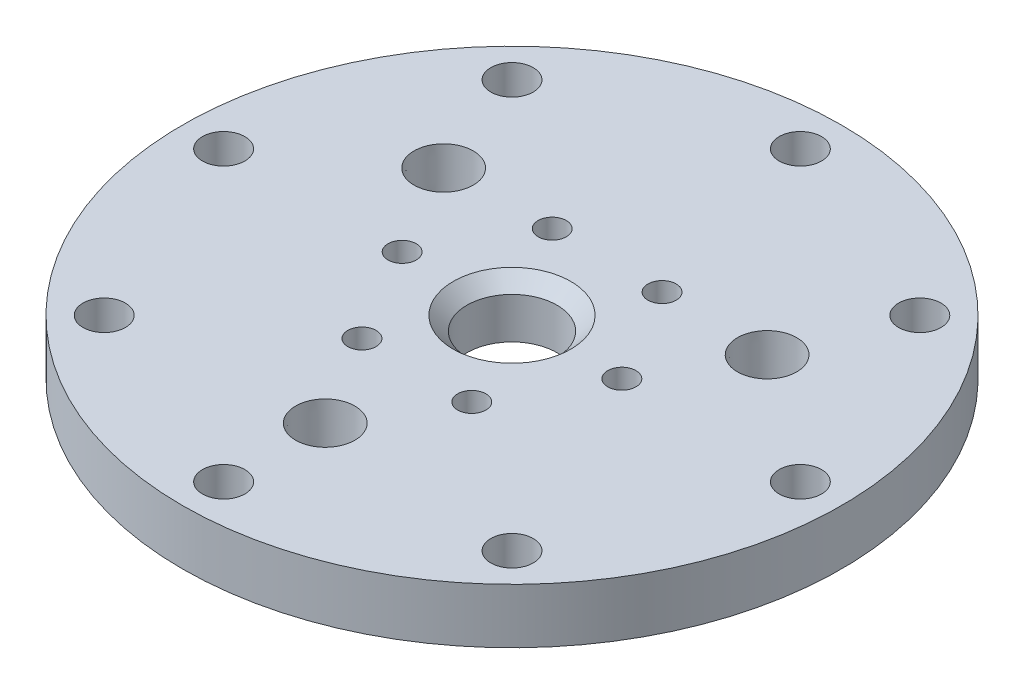
ISO-10303-21;
HEADER;
FILE_DESCRIPTION(('STEP AP214'),'2;1');
FILE_NAME('part.step','',(''),(''),'','','');
FILE_SCHEMA(('AUTOMOTIVE_DESIGN { 1 0 10303 214 1 1 1 1 }'));
ENDSEC;
DATA;
#1=APPLICATION_CONTEXT('core data for automotive mechanical design processes');
#2=APPLICATION_PROTOCOL_DEFINITION('international standard','automotive_design',2000,#1);
#3=PRODUCT_CONTEXT('',#1,'mechanical');
#4=PRODUCT('Part','Part','',(#3));
#5=PRODUCT_RELATED_PRODUCT_CATEGORY('part','',(#4));
#6=PRODUCT_DEFINITION_FORMATION('','',#4);
#7=PRODUCT_DEFINITION_CONTEXT('part definition',#1,'design');
#8=PRODUCT_DEFINITION('design','',#6,#7);
#9=PRODUCT_DEFINITION_SHAPE('','',#8);
#10=(LENGTH_UNIT() NAMED_UNIT(*) SI_UNIT(.MILLI.,.METRE.));
#11=(NAMED_UNIT(*) PLANE_ANGLE_UNIT() SI_UNIT($,.RADIAN.));
#12=(NAMED_UNIT(*) SI_UNIT($,.STERADIAN.) SOLID_ANGLE_UNIT());
#13=UNCERTAINTY_MEASURE_WITH_UNIT(LENGTH_MEASURE(1.E-05),#10,'distance_accuracy_value','');
#14=(GEOMETRIC_REPRESENTATION_CONTEXT(3) GLOBAL_UNCERTAINTY_ASSIGNED_CONTEXT((#13)) GLOBAL_UNIT_ASSIGNED_CONTEXT((#10,
#11,#12)) REPRESENTATION_CONTEXT('',''));
#15=CARTESIAN_POINT('',(0.,0.,0.));
#16=DIRECTION('',(0.,0.,1.));
#17=DIRECTION('',(1.,0.,0.));
#18=AXIS2_PLACEMENT_3D('',#15,#16,#17);
#19=CARTESIAN_POINT('',(0.,12.7,0.));
#20=DIRECTION('',(0.,-1.,0.));
#21=DIRECTION('',(0.,0.,-1.));
#22=AXIS2_PLACEMENT_3D('',#19,#20,#21);
#23=CYLINDRICAL_SURFACE('',#22,76.2);
#24=CARTESIAN_POINT('',(0.,12.7,0.));
#25=DIRECTION('',(0.,1.,0.));
#26=DIRECTION('',(0.,0.,1.));
#27=AXIS2_PLACEMENT_3D('',#24,#25,#26);
#28=CIRCLE('',#27,76.2);
#29=CARTESIAN_POINT('',(0.,12.7,76.2));
#30=VERTEX_POINT('',#29);
#31=EDGE_CURVE('E42',#30,#30,#28,.T.);
#32=ORIENTED_EDGE('',*,*,#31,.F.);
#33=EDGE_LOOP('',(#32));
#34=FACE_BOUND('',#33,.T.);
#35=CARTESIAN_POINT('',(0.,0.,0.));
#36=DIRECTION('',(0.,1.,0.));
#37=DIRECTION('',(0.,0.,1.));
#38=AXIS2_PLACEMENT_3D('',#35,#36,#37);
#39=CIRCLE('',#38,76.2);
#40=CARTESIAN_POINT('',(0.,0.,76.2));
#41=VERTEX_POINT('',#40);
#42=EDGE_CURVE('E46',#41,#41,#39,.T.);
#43=ORIENTED_EDGE('',*,*,#42,.T.);
#44=EDGE_LOOP('',(#43));
#45=FACE_BOUND('',#44,.T.);
#46=ADVANCED_FACE('F31',(#34,#45),#23,.T.);
#47=CARTESIAN_POINT('',(0.,12.7,0.));
#48=DIRECTION('',(0.,1.,0.));
#49=DIRECTION('',(0.,0.,1.));
#50=AXIS2_PLACEMENT_3D('',#47,#48,#49);
#51=PLANE('',#50);
#52=CARTESIAN_POINT('',(0.,12.7,0.));
#53=DIRECTION('',(0.,1.,0.));
#54=DIRECTION('',(0.,0.,1.));
#55=AXIS2_PLACEMENT_3D('',#52,#53,#54);
#56=CIRCLE('',#55,13.589);
#57=CARTESIAN_POINT('',(0.,12.7,13.589));
#58=VERTEX_POINT('',#57);
#59=EDGE_CURVE('E10',#58,#58,#56,.F.);
#60=ORIENTED_EDGE('',*,*,#59,.T.);
#61=EDGE_LOOP('',(#60));
#62=FACE_BOUND('',#61,.T.);
#63=CARTESIAN_POINT('',(0.,12.7,43.18));
#64=DIRECTION('',(0.,1.,0.));
#65=DIRECTION('',(0.,0.,1.));
#66=AXIS2_PLACEMENT_3D('',#63,#64,#65);
#67=CIRCLE('',#66,6.8545837);
#68=CARTESIAN_POINT('',(0.,12.7,50.0345837));
#69=VERTEX_POINT('',#68);
#70=EDGE_CURVE('E168',#69,#69,#67,.T.);
#71=ORIENTED_EDGE('',*,*,#70,.F.);
#72=EDGE_LOOP('',(#71));
#73=FACE_BOUND('',#72,.T.);
#74=CARTESIAN_POINT('',(37.3949769354121,12.7,-21.59));
#75=DIRECTION('',(0.,1.,0.));
#76=DIRECTION('',(0.,0.,1.));
#77=AXIS2_PLACEMENT_3D('',#74,#75,#76);
#78=CIRCLE('',#77,6.8545837);
#79=CARTESIAN_POINT('',(37.3949769354121,12.7,-14.7354163));
#80=VERTEX_POINT('',#79);
#81=EDGE_CURVE('E156',#80,#80,#78,.T.);
#82=ORIENTED_EDGE('',*,*,#81,.F.);
#83=EDGE_LOOP('',(#82));
#84=FACE_BOUND('',#83,.T.);
#85=CARTESIAN_POINT('',(-37.3949769354121,12.7,-21.59));
#86=DIRECTION('',(0.,1.,0.));
#87=DIRECTION('',(0.,0.,1.));
#88=AXIS2_PLACEMENT_3D('',#85,#86,#87);
#89=CIRCLE('',#88,6.8545837);
#90=CARTESIAN_POINT('',(-37.3949769354121,12.7,-14.7354163));
#91=VERTEX_POINT('',#90);
#92=EDGE_CURVE('E144',#91,#91,#89,.T.);
#93=ORIENTED_EDGE('',*,*,#92,.F.);
#94=EDGE_LOOP('',(#93));
#95=FACE_BOUND('',#94,.T.);
#96=CARTESIAN_POINT('',(25.4,12.7,0.));
#97=DIRECTION('',(0.,1.,0.));
#98=DIRECTION('',(0.,0.,1.));
#99=AXIS2_PLACEMENT_3D('',#96,#97,#98);
#100=CIRCLE('',#99,3.2639);
#101=CARTESIAN_POINT('',(25.4,12.7,3.2639));
#102=VERTEX_POINT('',#101);
#103=EDGE_CURVE('E132',#102,#102,#100,.T.);
#104=ORIENTED_EDGE('',*,*,#103,.F.);
#105=EDGE_LOOP('',(#104));
#106=FACE_BOUND('',#105,.T.);
#107=CARTESIAN_POINT('',(12.7,12.7,-21.9970452561248));
#108=DIRECTION('',(0.,1.,0.));
#109=DIRECTION('',(0.,0.,1.));
#110=AXIS2_PLACEMENT_3D('',#107,#108,#109);
#111=CIRCLE('',#110,3.2639);
#112=CARTESIAN_POINT('',(12.7,12.7,-18.7331452561248));
#113=VERTEX_POINT('',#112);
#114=EDGE_CURVE('E126',#113,#113,#111,.T.);
#115=ORIENTED_EDGE('',*,*,#114,.F.);
#116=EDGE_LOOP('',(#115));
#117=FACE_BOUND('',#116,.T.);
#118=CARTESIAN_POINT('',(-12.7,12.7,-21.9970452561248));
#119=DIRECTION('',(0.,1.,0.));
#120=DIRECTION('',(0.,0.,1.));
#121=AXIS2_PLACEMENT_3D('',#118,#119,#120);
#122=CIRCLE('',#121,3.2639);
#123=CARTESIAN_POINT('',(-12.7,12.7,-18.7331452561248));
#124=VERTEX_POINT('',#123);
#125=EDGE_CURVE('E120',#124,#124,#122,.T.);
#126=ORIENTED_EDGE('',*,*,#125,.F.);
#127=EDGE_LOOP('',(#126));
#128=FACE_BOUND('',#127,.T.);
#129=CARTESIAN_POINT('',(-25.4,12.7,0.));
#130=DIRECTION('',(0.,1.,0.));
#131=DIRECTION('',(0.,0.,1.));
#132=AXIS2_PLACEMENT_3D('',#129,#130,#131);
#133=CIRCLE('',#132,3.2639);
#134=CARTESIAN_POINT('',(-25.4,12.7,3.26389999999997));
#135=VERTEX_POINT('',#134);
#136=EDGE_CURVE('E114',#135,#135,#133,.T.);
#137=ORIENTED_EDGE('',*,*,#136,.F.);
#138=EDGE_LOOP('',(#137));
#139=FACE_BOUND('',#138,.T.);
#140=CARTESIAN_POINT('',(-12.7,12.7,21.9970452561247));
#141=DIRECTION('',(0.,1.,0.));
#142=DIRECTION('',(0.,0.,1.));
#143=AXIS2_PLACEMENT_3D('',#140,#141,#142);
#144=CIRCLE('',#143,3.2639);
#145=CARTESIAN_POINT('',(-12.7,12.7,25.2609452561247));
#146=VERTEX_POINT('',#145);
#147=EDGE_CURVE('E108',#146,#146,#144,.T.);
#148=ORIENTED_EDGE('',*,*,#147,.F.);
#149=EDGE_LOOP('',(#148));
#150=FACE_BOUND('',#149,.T.);
#151=CARTESIAN_POINT('',(12.7,12.7,21.9970452561247));
#152=DIRECTION('',(0.,1.,0.));
#153=DIRECTION('',(0.,0.,1.));
#154=AXIS2_PLACEMENT_3D('',#151,#152,#153);
#155=CIRCLE('',#154,3.2639);
#156=CARTESIAN_POINT('',(12.7,12.7,25.2609452561247));
#157=VERTEX_POINT('',#156);
#158=EDGE_CURVE('E102',#157,#157,#155,.T.);
#159=ORIENTED_EDGE('',*,*,#158,.F.);
#160=EDGE_LOOP('',(#159));
#161=FACE_BOUND('',#160,.T.);
#162=CARTESIAN_POINT('',(66.675,12.7,-7.868511452409E-13));
#163=DIRECTION('',(0.,1.,0.));
#164=DIRECTION('',(0.,0.,1.));
#165=AXIS2_PLACEMENT_3D('',#162,#163,#164);
#166=CIRCLE('',#165,4.90219999999998);
#167=CARTESIAN_POINT('',(66.675,12.7,4.90219999999919));
#168=VERTEX_POINT('',#167);
#169=EDGE_CURVE('E96',#168,#168,#166,.T.);
#170=ORIENTED_EDGE('',*,*,#169,.F.);
#171=EDGE_LOOP('',(#170));
#172=FACE_BOUND('',#171,.T.);
#173=CARTESIAN_POINT('',(47.1463446356131,12.7,-47.1463446356131));
#174=DIRECTION('',(0.,1.,0.));
#175=DIRECTION('',(0.,0.,1.));
#176=AXIS2_PLACEMENT_3D('',#173,#174,#175);
#177=CIRCLE('',#176,4.90219999999999);
#178=CARTESIAN_POINT('',(47.1463446356131,12.7,-42.2441446356131));
#179=VERTEX_POINT('',#178);
#180=EDGE_CURVE('E90',#179,#179,#177,.T.);
#181=ORIENTED_EDGE('',*,*,#180,.F.);
#182=EDGE_LOOP('',(#181));
#183=FACE_BOUND('',#182,.T.);
#184=CARTESIAN_POINT('',(0.,12.7,-66.675));
#185=DIRECTION('',(0.,1.,0.));
#186=DIRECTION('',(0.,0.,1.));
#187=AXIS2_PLACEMENT_3D('',#184,#185,#186);
#188=CIRCLE('',#187,4.90219999999999);
#189=CARTESIAN_POINT('',(0.,12.7,-61.7728));
#190=VERTEX_POINT('',#189);
#191=EDGE_CURVE('E84',#190,#190,#188,.T.);
#192=ORIENTED_EDGE('',*,*,#191,.F.);
#193=EDGE_LOOP('',(#192));
#194=FACE_BOUND('',#193,.T.);
#195=CARTESIAN_POINT('',(-47.1463446356131,12.7,-47.1463446356131));
#196=DIRECTION('',(0.,1.,0.));
#197=DIRECTION('',(0.,0.,1.));
#198=AXIS2_PLACEMENT_3D('',#195,#196,#197);
#199=CIRCLE('',#198,4.90219999999999);
#200=CARTESIAN_POINT('',(-47.1463446356131,12.7,-42.2441446356131));
#201=VERTEX_POINT('',#200);
#202=EDGE_CURVE('E78',#201,#201,#199,.T.);
#203=ORIENTED_EDGE('',*,*,#202,.F.);
#204=EDGE_LOOP('',(#203));
#205=FACE_BOUND('',#204,.T.);
#206=CARTESIAN_POINT('',(-66.675,12.7,0.));
#207=DIRECTION('',(0.,1.,0.));
#208=DIRECTION('',(0.,0.,1.));
#209=AXIS2_PLACEMENT_3D('',#206,#207,#208);
#210=CIRCLE('',#209,4.90219999999999);
#211=CARTESIAN_POINT('',(-66.675,12.7,4.90219999999999));
#212=VERTEX_POINT('',#211);
#213=EDGE_CURVE('E72',#212,#212,#210,.T.);
#214=ORIENTED_EDGE('',*,*,#213,.F.);
#215=EDGE_LOOP('',(#214));
#216=FACE_BOUND('',#215,.T.);
#217=CARTESIAN_POINT('',(-47.1463446356131,12.7,47.146344635613));
#218=DIRECTION('',(0.,1.,0.));
#219=DIRECTION('',(0.,0.,1.));
#220=AXIS2_PLACEMENT_3D('',#217,#218,#219);
#221=CIRCLE('',#220,4.90219999999999);
#222=CARTESIAN_POINT('',(-47.1463446356131,12.7,52.048544635613));
#223=VERTEX_POINT('',#222);
#224=EDGE_CURVE('E66',#223,#223,#221,.T.);
#225=ORIENTED_EDGE('',*,*,#224,.F.);
#226=EDGE_LOOP('',(#225));
#227=FACE_BOUND('',#226,.T.);
#228=CARTESIAN_POINT('',(0.,12.7,66.675));
#229=DIRECTION('',(0.,1.,0.));
#230=DIRECTION('',(0.,0.,1.));
#231=AXIS2_PLACEMENT_3D('',#228,#229,#230);
#232=CIRCLE('',#231,4.90219999999999);
#233=CARTESIAN_POINT('',(0.,12.7,71.5772));
#234=VERTEX_POINT('',#233);
#235=EDGE_CURVE('E60',#234,#234,#232,.T.);
#236=ORIENTED_EDGE('',*,*,#235,.F.);
#237=EDGE_LOOP('',(#236));
#238=FACE_BOUND('',#237,.T.);
#239=CARTESIAN_POINT('',(47.146344635613,12.7,47.1463446356131));
#240=DIRECTION('',(0.,1.,0.));
#241=DIRECTION('',(0.,0.,1.));
#242=AXIS2_PLACEMENT_3D('',#239,#240,#241);
#243=CIRCLE('',#242,4.90219999999999);
#244=CARTESIAN_POINT('',(47.146344635613,12.7,52.0485446356131));
#245=VERTEX_POINT('',#244);
#246=EDGE_CURVE('E54',#245,#245,#243,.T.);
#247=ORIENTED_EDGE('',*,*,#246,.F.);
#248=EDGE_LOOP('',(#247));
#249=FACE_BOUND('',#248,.T.);
#250=ORIENTED_EDGE('',*,*,#31,.T.);
#251=EDGE_LOOP('',(#250));
#252=FACE_BOUND('',#251,.T.);
#253=ADVANCED_FACE('F191',(#62,#73,#84,#95,#106,#117,#128,#139,#150,#161,#172,#183,#194,#205,
#216,#227,#238,#249,#252),#51,.T.);
#254=CARTESIAN_POINT('',(0.,0.,0.));
#255=DIRECTION('',(0.,1.,0.));
#256=DIRECTION('',(0.,0.,1.));
#257=AXIS2_PLACEMENT_3D('',#254,#255,#256);
#258=PLANE('',#257);
#259=CARTESIAN_POINT('',(0.,0.,0.));
#260=DIRECTION('',(0.,1.,0.));
#261=DIRECTION('',(0.,0.,1.));
#262=AXIS2_PLACEMENT_3D('',#259,#260,#261);
#263=CIRCLE('',#262,10.414);
#264=CARTESIAN_POINT('',(0.,0.,10.414));
#265=VERTEX_POINT('',#264);
#266=EDGE_CURVE('E171',#265,#265,#263,.T.);
#267=ORIENTED_EDGE('',*,*,#266,.T.);
#268=EDGE_LOOP('',(#267));
#269=FACE_BOUND('',#268,.T.);
#270=CARTESIAN_POINT('',(0.,0.,43.18));
#271=DIRECTION('',(0.,1.,0.));
#272=DIRECTION('',(0.,0.,1.));
#273=AXIS2_PLACEMENT_3D('',#270,#271,#272);
#274=CIRCLE('',#273,5.5626);
#275=CARTESIAN_POINT('',(0.,0.,48.7426));
#276=VERTEX_POINT('',#275);
#277=EDGE_CURVE('E159',#276,#276,#274,.T.);
#278=ORIENTED_EDGE('',*,*,#277,.T.);
#279=EDGE_LOOP('',(#278));
#280=FACE_BOUND('',#279,.T.);
#281=CARTESIAN_POINT('',(37.3949769354121,0.,-21.59));
#282=DIRECTION('',(0.,1.,0.));
#283=DIRECTION('',(0.,0.,1.));
#284=AXIS2_PLACEMENT_3D('',#281,#282,#283);
#285=CIRCLE('',#284,5.5626);
#286=CARTESIAN_POINT('',(37.3949769354121,0.,-16.0274));
#287=VERTEX_POINT('',#286);
#288=EDGE_CURVE('E147',#287,#287,#285,.T.);
#289=ORIENTED_EDGE('',*,*,#288,.T.);
#290=EDGE_LOOP('',(#289));
#291=FACE_BOUND('',#290,.T.);
#292=CARTESIAN_POINT('',(-37.3949769354121,0.,-21.59));
#293=DIRECTION('',(0.,1.,0.));
#294=DIRECTION('',(0.,0.,1.));
#295=AXIS2_PLACEMENT_3D('',#292,#293,#294);
#296=CIRCLE('',#295,5.5626);
#297=CARTESIAN_POINT('',(-37.3949769354121,0.,-16.0274));
#298=VERTEX_POINT('',#297);
#299=EDGE_CURVE('E135',#298,#298,#296,.T.);
#300=ORIENTED_EDGE('',*,*,#299,.T.);
#301=EDGE_LOOP('',(#300));
#302=FACE_BOUND('',#301,.T.);
#303=CARTESIAN_POINT('',(25.4,0.,0.));
#304=DIRECTION('',(0.,1.,0.));
#305=DIRECTION('',(0.,0.,1.));
#306=AXIS2_PLACEMENT_3D('',#303,#304,#305);
#307=CIRCLE('',#306,3.2639);
#308=CARTESIAN_POINT('',(25.4,0.,3.2639));
#309=VERTEX_POINT('',#308);
#310=EDGE_CURVE('E129',#309,#309,#307,.T.);
#311=ORIENTED_EDGE('',*,*,#310,.T.);
#312=EDGE_LOOP('',(#311));
#313=FACE_BOUND('',#312,.T.);
#314=CARTESIAN_POINT('',(12.7,0.,-21.9970452561248));
#315=DIRECTION('',(0.,1.,0.));
#316=DIRECTION('',(0.,0.,1.));
#317=AXIS2_PLACEMENT_3D('',#314,#315,#316);
#318=CIRCLE('',#317,3.2639);
#319=CARTESIAN_POINT('',(12.7,0.,-18.7331452561248));
#320=VERTEX_POINT('',#319);
#321=EDGE_CURVE('E123',#320,#320,#318,.T.);
#322=ORIENTED_EDGE('',*,*,#321,.T.);
#323=EDGE_LOOP('',(#322));
#324=FACE_BOUND('',#323,.T.);
#325=CARTESIAN_POINT('',(-12.7,0.,-21.9970452561248));
#326=DIRECTION('',(0.,1.,0.));
#327=DIRECTION('',(0.,0.,1.));
#328=AXIS2_PLACEMENT_3D('',#325,#326,#327);
#329=CIRCLE('',#328,3.2639);
#330=CARTESIAN_POINT('',(-12.7,0.,-18.7331452561248));
#331=VERTEX_POINT('',#330);
#332=EDGE_CURVE('E117',#331,#331,#329,.T.);
#333=ORIENTED_EDGE('',*,*,#332,.T.);
#334=EDGE_LOOP('',(#333));
#335=FACE_BOUND('',#334,.T.);
#336=CARTESIAN_POINT('',(-25.4,0.,0.));
#337=DIRECTION('',(0.,1.,0.));
#338=DIRECTION('',(0.,0.,1.));
#339=AXIS2_PLACEMENT_3D('',#336,#337,#338);
#340=CIRCLE('',#339,3.2639);
#341=CARTESIAN_POINT('',(-25.4,0.,3.26389999999997));
#342=VERTEX_POINT('',#341);
#343=EDGE_CURVE('E111',#342,#342,#340,.T.);
#344=ORIENTED_EDGE('',*,*,#343,.T.);
#345=EDGE_LOOP('',(#344));
#346=FACE_BOUND('',#345,.T.);
#347=CARTESIAN_POINT('',(-12.7,0.,21.9970452561247));
#348=DIRECTION('',(0.,1.,0.));
#349=DIRECTION('',(0.,0.,1.));
#350=AXIS2_PLACEMENT_3D('',#347,#348,#349);
#351=CIRCLE('',#350,3.2639);
#352=CARTESIAN_POINT('',(-12.7,0.,25.2609452561247));
#353=VERTEX_POINT('',#352);
#354=EDGE_CURVE('E105',#353,#353,#351,.T.);
#355=ORIENTED_EDGE('',*,*,#354,.T.);
#356=EDGE_LOOP('',(#355));
#357=FACE_BOUND('',#356,.T.);
#358=CARTESIAN_POINT('',(12.7,0.,21.9970452561247));
#359=DIRECTION('',(0.,1.,0.));
#360=DIRECTION('',(0.,0.,1.));
#361=AXIS2_PLACEMENT_3D('',#358,#359,#360);
#362=CIRCLE('',#361,3.2639);
#363=CARTESIAN_POINT('',(12.7,0.,25.2609452561247));
#364=VERTEX_POINT('',#363);
#365=EDGE_CURVE('E99',#364,#364,#362,.T.);
#366=ORIENTED_EDGE('',*,*,#365,.T.);
#367=EDGE_LOOP('',(#366));
#368=FACE_BOUND('',#367,.T.);
#369=CARTESIAN_POINT('',(66.675,0.,-7.868511452409E-13));
#370=DIRECTION('',(0.,1.,0.));
#371=DIRECTION('',(0.,0.,1.));
#372=AXIS2_PLACEMENT_3D('',#369,#370,#371);
#373=CIRCLE('',#372,4.9022);
#374=CARTESIAN_POINT('',(66.675,0.,4.90219999999921));
#375=VERTEX_POINT('',#374);
#376=EDGE_CURVE('E93',#375,#375,#373,.T.);
#377=ORIENTED_EDGE('',*,*,#376,.T.);
#378=EDGE_LOOP('',(#377));
#379=FACE_BOUND('',#378,.T.);
#380=CARTESIAN_POINT('',(47.1463446356131,0.,-47.1463446356131));
#381=DIRECTION('',(0.,1.,0.));
#382=DIRECTION('',(0.,0.,1.));
#383=AXIS2_PLACEMENT_3D('',#380,#381,#382);
#384=CIRCLE('',#383,4.9022);
#385=CARTESIAN_POINT('',(47.1463446356131,0.,-42.2441446356131));
#386=VERTEX_POINT('',#385);
#387=EDGE_CURVE('E87',#386,#386,#384,.T.);
#388=ORIENTED_EDGE('',*,*,#387,.T.);
#389=EDGE_LOOP('',(#388));
#390=FACE_BOUND('',#389,.T.);
#391=CARTESIAN_POINT('',(0.,0.,-66.675));
#392=DIRECTION('',(0.,1.,0.));
#393=DIRECTION('',(0.,0.,1.));
#394=AXIS2_PLACEMENT_3D('',#391,#392,#393);
#395=CIRCLE('',#394,4.9022);
#396=CARTESIAN_POINT('',(0.,0.,-61.7728));
#397=VERTEX_POINT('',#396);
#398=EDGE_CURVE('E81',#397,#397,#395,.T.);
#399=ORIENTED_EDGE('',*,*,#398,.T.);
#400=EDGE_LOOP('',(#399));
#401=FACE_BOUND('',#400,.T.);
#402=CARTESIAN_POINT('',(-47.1463446356131,0.,-47.1463446356131));
#403=DIRECTION('',(0.,1.,0.));
#404=DIRECTION('',(0.,0.,1.));
#405=AXIS2_PLACEMENT_3D('',#402,#403,#404);
#406=CIRCLE('',#405,4.9022);
#407=CARTESIAN_POINT('',(-47.1463446356131,0.,-42.2441446356131));
#408=VERTEX_POINT('',#407);
#409=EDGE_CURVE('E75',#408,#408,#406,.T.);
#410=ORIENTED_EDGE('',*,*,#409,.T.);
#411=EDGE_LOOP('',(#410));
#412=FACE_BOUND('',#411,.T.);
#413=CARTESIAN_POINT('',(-66.675,0.,0.));
#414=DIRECTION('',(0.,1.,0.));
#415=DIRECTION('',(0.,0.,1.));
#416=AXIS2_PLACEMENT_3D('',#413,#414,#415);
#417=CIRCLE('',#416,4.9022);
#418=CARTESIAN_POINT('',(-66.675,0.,4.9022));
#419=VERTEX_POINT('',#418);
#420=EDGE_CURVE('E69',#419,#419,#417,.T.);
#421=ORIENTED_EDGE('',*,*,#420,.T.);
#422=EDGE_LOOP('',(#421));
#423=FACE_BOUND('',#422,.T.);
#424=CARTESIAN_POINT('',(-47.1463446356131,0.,47.146344635613));
#425=DIRECTION('',(0.,1.,0.));
#426=DIRECTION('',(0.,0.,1.));
#427=AXIS2_PLACEMENT_3D('',#424,#425,#426);
#428=CIRCLE('',#427,4.9022);
#429=CARTESIAN_POINT('',(-47.1463446356131,0.,52.048544635613));
#430=VERTEX_POINT('',#429);
#431=EDGE_CURVE('E63',#430,#430,#428,.T.);
#432=ORIENTED_EDGE('',*,*,#431,.T.);
#433=EDGE_LOOP('',(#432));
#434=FACE_BOUND('',#433,.T.);
#435=CARTESIAN_POINT('',(0.,0.,66.675));
#436=DIRECTION('',(0.,1.,0.));
#437=DIRECTION('',(0.,0.,1.));
#438=AXIS2_PLACEMENT_3D('',#435,#436,#437);
#439=CIRCLE('',#438,4.9022);
#440=CARTESIAN_POINT('',(0.,0.,71.5772));
#441=VERTEX_POINT('',#440);
#442=EDGE_CURVE('E57',#441,#441,#439,.T.);
#443=ORIENTED_EDGE('',*,*,#442,.T.);
#444=EDGE_LOOP('',(#443));
#445=FACE_BOUND('',#444,.T.);
#446=CARTESIAN_POINT('',(47.146344635613,0.,47.1463446356131));
#447=DIRECTION('',(0.,1.,0.));
#448=DIRECTION('',(0.,0.,1.));
#449=AXIS2_PLACEMENT_3D('',#446,#447,#448);
#450=CIRCLE('',#449,4.9022);
#451=CARTESIAN_POINT('',(47.146344635613,0.,52.0485446356131));
#452=VERTEX_POINT('',#451);
#453=EDGE_CURVE('E50',#452,#452,#450,.T.);
#454=ORIENTED_EDGE('',*,*,#453,.T.);
#455=EDGE_LOOP('',(#454));
#456=FACE_BOUND('',#455,.T.);
#457=ORIENTED_EDGE('',*,*,#42,.F.);
#458=EDGE_LOOP('',(#457));
#459=FACE_BOUND('',#458,.T.);
#460=ADVANCED_FACE('F175',(#269,#280,#291,#302,#313,#324,#335,#346,#357,#368,#379,#390,#401,
#412,#423,#434,#445,#456,#459),#258,.F.);
#461=CARTESIAN_POINT('',(47.146344635613,12.7,47.1463446356131));
#462=DIRECTION('',(0.,1.,0.));
#463=DIRECTION('',(0.,0.,1.));
#464=AXIS2_PLACEMENT_3D('',#461,#462,#463);
#465=CYLINDRICAL_SURFACE('',#464,4.90219999999999);
#466=ORIENTED_EDGE('',*,*,#453,.F.);
#467=EDGE_LOOP('',(#466));
#468=FACE_BOUND('',#467,.T.);
#469=ORIENTED_EDGE('',*,*,#246,.T.);
#470=EDGE_LOOP('',(#469));
#471=FACE_BOUND('',#470,.T.);
#472=ADVANCED_FACE('F201',(#468,#471),#465,.F.);
#473=CARTESIAN_POINT('',(0.,12.7,66.675));
#474=DIRECTION('',(0.,1.,0.));
#475=DIRECTION('',(0.,0.,1.));
#476=AXIS2_PLACEMENT_3D('',#473,#474,#475);
#477=CYLINDRICAL_SURFACE('',#476,4.90219999999999);
#478=ORIENTED_EDGE('',*,*,#442,.F.);
#479=EDGE_LOOP('',(#478));
#480=FACE_BOUND('',#479,.T.);
#481=ORIENTED_EDGE('',*,*,#235,.T.);
#482=EDGE_LOOP('',(#481));
#483=FACE_BOUND('',#482,.T.);
#484=ADVANCED_FACE('F205',(#480,#483),#477,.F.);
#485=CARTESIAN_POINT('',(-47.1463446356131,12.7,47.146344635613));
#486=DIRECTION('',(0.,1.,0.));
#487=DIRECTION('',(0.,0.,1.));
#488=AXIS2_PLACEMENT_3D('',#485,#486,#487);
#489=CYLINDRICAL_SURFACE('',#488,4.90219999999999);
#490=ORIENTED_EDGE('',*,*,#431,.F.);
#491=EDGE_LOOP('',(#490));
#492=FACE_BOUND('',#491,.T.);
#493=ORIENTED_EDGE('',*,*,#224,.T.);
#494=EDGE_LOOP('',(#493));
#495=FACE_BOUND('',#494,.T.);
#496=ADVANCED_FACE('F209',(#492,#495),#489,.F.);
#497=CARTESIAN_POINT('',(-66.675,12.7,0.));
#498=DIRECTION('',(0.,1.,0.));
#499=DIRECTION('',(0.,0.,1.));
#500=AXIS2_PLACEMENT_3D('',#497,#498,#499);
#501=CYLINDRICAL_SURFACE('',#500,4.90219999999999);
#502=ORIENTED_EDGE('',*,*,#420,.F.);
#503=EDGE_LOOP('',(#502));
#504=FACE_BOUND('',#503,.T.);
#505=ORIENTED_EDGE('',*,*,#213,.T.);
#506=EDGE_LOOP('',(#505));
#507=FACE_BOUND('',#506,.T.);
#508=ADVANCED_FACE('F213',(#504,#507),#501,.F.);
#509=CARTESIAN_POINT('',(-47.1463446356131,12.7,-47.1463446356131));
#510=DIRECTION('',(0.,1.,0.));
#511=DIRECTION('',(0.,0.,1.));
#512=AXIS2_PLACEMENT_3D('',#509,#510,#511);
#513=CYLINDRICAL_SURFACE('',#512,4.90219999999999);
#514=ORIENTED_EDGE('',*,*,#409,.F.);
#515=EDGE_LOOP('',(#514));
#516=FACE_BOUND('',#515,.T.);
#517=ORIENTED_EDGE('',*,*,#202,.T.);
#518=EDGE_LOOP('',(#517));
#519=FACE_BOUND('',#518,.T.);
#520=ADVANCED_FACE('F217',(#516,#519),#513,.F.);
#521=CARTESIAN_POINT('',(0.,12.7,-66.675));
#522=DIRECTION('',(0.,1.,0.));
#523=DIRECTION('',(0.,0.,1.));
#524=AXIS2_PLACEMENT_3D('',#521,#522,#523);
#525=CYLINDRICAL_SURFACE('',#524,4.90219999999999);
#526=ORIENTED_EDGE('',*,*,#398,.F.);
#527=EDGE_LOOP('',(#526));
#528=FACE_BOUND('',#527,.T.);
#529=ORIENTED_EDGE('',*,*,#191,.T.);
#530=EDGE_LOOP('',(#529));
#531=FACE_BOUND('',#530,.T.);
#532=ADVANCED_FACE('F221',(#528,#531),#525,.F.);
#533=CARTESIAN_POINT('',(47.1463446356131,12.7,-47.1463446356131));
#534=DIRECTION('',(0.,1.,0.));
#535=DIRECTION('',(0.,0.,1.));
#536=AXIS2_PLACEMENT_3D('',#533,#534,#535);
#537=CYLINDRICAL_SURFACE('',#536,4.90219999999999);
#538=ORIENTED_EDGE('',*,*,#387,.F.);
#539=EDGE_LOOP('',(#538));
#540=FACE_BOUND('',#539,.T.);
#541=ORIENTED_EDGE('',*,*,#180,.T.);
#542=EDGE_LOOP('',(#541));
#543=FACE_BOUND('',#542,.T.);
#544=ADVANCED_FACE('F225',(#540,#543),#537,.F.);
#545=CARTESIAN_POINT('',(66.675,12.7,-7.868511452409E-13));
#546=DIRECTION('',(0.,1.,0.));
#547=DIRECTION('',(0.,0.,1.));
#548=AXIS2_PLACEMENT_3D('',#545,#546,#547);
#549=CYLINDRICAL_SURFACE('',#548,4.90219999999999);
#550=ORIENTED_EDGE('',*,*,#376,.F.);
#551=EDGE_LOOP('',(#550));
#552=FACE_BOUND('',#551,.T.);
#553=ORIENTED_EDGE('',*,*,#169,.T.);
#554=EDGE_LOOP('',(#553));
#555=FACE_BOUND('',#554,.T.);
#556=ADVANCED_FACE('F229',(#552,#555),#549,.F.);
#557=CARTESIAN_POINT('',(12.7,12.7,21.9970452561247));
#558=DIRECTION('',(0.,1.,0.));
#559=DIRECTION('',(0.,0.,1.));
#560=AXIS2_PLACEMENT_3D('',#557,#558,#559);
#561=CYLINDRICAL_SURFACE('',#560,3.2639);
#562=ORIENTED_EDGE('',*,*,#365,.F.);
#563=EDGE_LOOP('',(#562));
#564=FACE_BOUND('',#563,.T.);
#565=ORIENTED_EDGE('',*,*,#158,.T.);
#566=EDGE_LOOP('',(#565));
#567=FACE_BOUND('',#566,.T.);
#568=ADVANCED_FACE('F233',(#564,#567),#561,.F.);
#569=CARTESIAN_POINT('',(-12.7,12.7,21.9970452561247));
#570=DIRECTION('',(0.,1.,0.));
#571=DIRECTION('',(0.,0.,1.));
#572=AXIS2_PLACEMENT_3D('',#569,#570,#571);
#573=CYLINDRICAL_SURFACE('',#572,3.2639);
#574=ORIENTED_EDGE('',*,*,#354,.F.);
#575=EDGE_LOOP('',(#574));
#576=FACE_BOUND('',#575,.T.);
#577=ORIENTED_EDGE('',*,*,#147,.T.);
#578=EDGE_LOOP('',(#577));
#579=FACE_BOUND('',#578,.T.);
#580=ADVANCED_FACE('F237',(#576,#579),#573,.F.);
#581=CARTESIAN_POINT('',(-25.4,12.7,0.));
#582=DIRECTION('',(0.,1.,0.));
#583=DIRECTION('',(0.,0.,1.));
#584=AXIS2_PLACEMENT_3D('',#581,#582,#583);
#585=CYLINDRICAL_SURFACE('',#584,3.2639);
#586=ORIENTED_EDGE('',*,*,#343,.F.);
#587=EDGE_LOOP('',(#586));
#588=FACE_BOUND('',#587,.T.);
#589=ORIENTED_EDGE('',*,*,#136,.T.);
#590=EDGE_LOOP('',(#589));
#591=FACE_BOUND('',#590,.T.);
#592=ADVANCED_FACE('F241',(#588,#591),#585,.F.);
#593=CARTESIAN_POINT('',(-12.7,12.7,-21.9970452561248));
#594=DIRECTION('',(0.,1.,0.));
#595=DIRECTION('',(0.,0.,1.));
#596=AXIS2_PLACEMENT_3D('',#593,#594,#595);
#597=CYLINDRICAL_SURFACE('',#596,3.2639);
#598=ORIENTED_EDGE('',*,*,#332,.F.);
#599=EDGE_LOOP('',(#598));
#600=FACE_BOUND('',#599,.T.);
#601=ORIENTED_EDGE('',*,*,#125,.T.);
#602=EDGE_LOOP('',(#601));
#603=FACE_BOUND('',#602,.T.);
#604=ADVANCED_FACE('F245',(#600,#603),#597,.F.);
#605=CARTESIAN_POINT('',(12.7,12.7,-21.9970452561248));
#606=DIRECTION('',(0.,1.,0.));
#607=DIRECTION('',(0.,0.,1.));
#608=AXIS2_PLACEMENT_3D('',#605,#606,#607);
#609=CYLINDRICAL_SURFACE('',#608,3.2639);
#610=ORIENTED_EDGE('',*,*,#321,.F.);
#611=EDGE_LOOP('',(#610));
#612=FACE_BOUND('',#611,.T.);
#613=ORIENTED_EDGE('',*,*,#114,.T.);
#614=EDGE_LOOP('',(#613));
#615=FACE_BOUND('',#614,.T.);
#616=ADVANCED_FACE('F249',(#612,#615),#609,.F.);
#617=CARTESIAN_POINT('',(25.4,12.7,0.));
#618=DIRECTION('',(0.,1.,0.));
#619=DIRECTION('',(0.,0.,1.));
#620=AXIS2_PLACEMENT_3D('',#617,#618,#619);
#621=CYLINDRICAL_SURFACE('',#620,3.2639);
#622=ORIENTED_EDGE('',*,*,#310,.F.);
#623=EDGE_LOOP('',(#622));
#624=FACE_BOUND('',#623,.T.);
#625=ORIENTED_EDGE('',*,*,#103,.T.);
#626=EDGE_LOOP('',(#625));
#627=FACE_BOUND('',#626,.T.);
#628=ADVANCED_FACE('F253',(#624,#627),#621,.F.);
#629=CARTESIAN_POINT('',(-37.3949769354121,12.7,-21.59));
#630=DIRECTION('',(0.,1.,0.));
#631=DIRECTION('',(0.,0.,1.));
#632=AXIS2_PLACEMENT_3D('',#629,#630,#631);
#633=CYLINDRICAL_SURFACE('',#632,5.5626);
#634=ORIENTED_EDGE('',*,*,#299,.F.);
#635=EDGE_LOOP('',(#634));
#636=FACE_BOUND('',#635,.T.);
#637=CARTESIAN_POINT('',(-37.3949769354121,2.794,-21.59));
#638=DIRECTION('',(0.,1.,0.));
#639=DIRECTION('',(0.,0.,1.));
#640=AXIS2_PLACEMENT_3D('',#637,#638,#639);
#641=CIRCLE('',#640,5.5626);
#642=CARTESIAN_POINT('',(-37.3949769354121,2.794,-16.0274));
#643=VERTEX_POINT('',#642);
#644=EDGE_CURVE('E138',#643,#643,#641,.T.);
#645=ORIENTED_EDGE('',*,*,#644,.T.);
#646=EDGE_LOOP('',(#645));
#647=FACE_BOUND('',#646,.T.);
#648=ADVANCED_FACE('F257',(#636,#647),#633,.F.);
#649=CARTESIAN_POINT('',(-31.8323769354121,2.794,-21.59));
#650=DIRECTION('',(0.,-1.,0.));
#651=DIRECTION('',(0.,0.,-1.));
#652=AXIS2_PLACEMENT_3D('',#649,#650,#651);
#653=PLANE('',#652);
#654=ORIENTED_EDGE('',*,*,#644,.F.);
#655=EDGE_LOOP('',(#654));
#656=FACE_BOUND('',#655,.T.);
#657=CARTESIAN_POINT('',(-37.3949769354121,2.794,-21.59));
#658=DIRECTION('',(0.,1.,0.));
#659=DIRECTION('',(0.,0.,1.));
#660=AXIS2_PLACEMENT_3D('',#657,#658,#659);
#661=CIRCLE('',#660,6.55798479417672);
#662=CARTESIAN_POINT('',(-37.3949769354121,2.794,-15.0320152058233));
#663=VERTEX_POINT('',#662);
#664=EDGE_CURVE('E141',#663,#663,#661,.T.);
#665=ORIENTED_EDGE('',*,*,#664,.T.);
#666=EDGE_LOOP('',(#665));
#667=FACE_BOUND('',#666,.T.);
#668=ADVANCED_FACE('F261',(#656,#667),#653,.F.);
#669=CARTESIAN_POINT('',(-37.3949769354121,12.7,-21.59));
#670=DIRECTION('',(0.,1.,0.));
#671=DIRECTION('',(0.,0.,1.));
#672=AXIS2_PLACEMENT_3D('',#669,#670,#671);
#673=CONICAL_SURFACE('',#672,6.8545837,0.0299323966717025);
#674=ORIENTED_EDGE('',*,*,#664,.F.);
#675=EDGE_LOOP('',(#674));
#676=FACE_BOUND('',#675,.T.);
#677=ORIENTED_EDGE('',*,*,#92,.T.);
#678=EDGE_LOOP('',(#677));
#679=FACE_BOUND('',#678,.T.);
#680=ADVANCED_FACE('F265',(#676,#679),#673,.F.);
#681=CARTESIAN_POINT('',(37.3949769354121,12.7,-21.59));
#682=DIRECTION('',(0.,1.,0.));
#683=DIRECTION('',(0.,0.,1.));
#684=AXIS2_PLACEMENT_3D('',#681,#682,#683);
#685=CYLINDRICAL_SURFACE('',#684,5.5626);
#686=ORIENTED_EDGE('',*,*,#288,.F.);
#687=EDGE_LOOP('',(#686));
#688=FACE_BOUND('',#687,.T.);
#689=CARTESIAN_POINT('',(37.3949769354121,2.794,-21.59));
#690=DIRECTION('',(0.,1.,0.));
#691=DIRECTION('',(0.,0.,1.));
#692=AXIS2_PLACEMENT_3D('',#689,#690,#691);
#693=CIRCLE('',#692,5.5626);
#694=CARTESIAN_POINT('',(37.3949769354121,2.794,-16.0274));
#695=VERTEX_POINT('',#694);
#696=EDGE_CURVE('E150',#695,#695,#693,.T.);
#697=ORIENTED_EDGE('',*,*,#696,.T.);
#698=EDGE_LOOP('',(#697));
#699=FACE_BOUND('',#698,.T.);
#700=ADVANCED_FACE('F269',(#688,#699),#685,.F.);
#701=CARTESIAN_POINT('',(42.9575769354121,2.794,-21.59));
#702=DIRECTION('',(0.,-1.,0.));
#703=DIRECTION('',(0.,0.,-1.));
#704=AXIS2_PLACEMENT_3D('',#701,#702,#703);
#705=PLANE('',#704);
#706=ORIENTED_EDGE('',*,*,#696,.F.);
#707=EDGE_LOOP('',(#706));
#708=FACE_BOUND('',#707,.T.);
#709=CARTESIAN_POINT('',(37.3949769354121,2.794,-21.59));
#710=DIRECTION('',(0.,1.,0.));
#711=DIRECTION('',(0.,0.,1.));
#712=AXIS2_PLACEMENT_3D('',#709,#710,#711);
#713=CIRCLE('',#712,6.55798479417672);
#714=CARTESIAN_POINT('',(37.3949769354121,2.794,-15.0320152058233));
#715=VERTEX_POINT('',#714);
#716=EDGE_CURVE('E153',#715,#715,#713,.T.);
#717=ORIENTED_EDGE('',*,*,#716,.T.);
#718=EDGE_LOOP('',(#717));
#719=FACE_BOUND('',#718,.T.);
#720=ADVANCED_FACE('F273',(#708,#719),#705,.F.);
#721=CARTESIAN_POINT('',(37.3949769354121,12.7,-21.59));
#722=DIRECTION('',(0.,1.,0.));
#723=DIRECTION('',(0.,0.,1.));
#724=AXIS2_PLACEMENT_3D('',#721,#722,#723);
#725=CONICAL_SURFACE('',#724,6.8545837,0.0299323966717025);
#726=ORIENTED_EDGE('',*,*,#716,.F.);
#727=EDGE_LOOP('',(#726));
#728=FACE_BOUND('',#727,.T.);
#729=ORIENTED_EDGE('',*,*,#81,.T.);
#730=EDGE_LOOP('',(#729));
#731=FACE_BOUND('',#730,.T.);
#732=ADVANCED_FACE('F277',(#728,#731),#725,.F.);
#733=CARTESIAN_POINT('',(0.,12.7,43.18));
#734=DIRECTION('',(0.,1.,0.));
#735=DIRECTION('',(0.,0.,1.));
#736=AXIS2_PLACEMENT_3D('',#733,#734,#735);
#737=CYLINDRICAL_SURFACE('',#736,5.5626);
#738=ORIENTED_EDGE('',*,*,#277,.F.);
#739=EDGE_LOOP('',(#738));
#740=FACE_BOUND('',#739,.T.);
#741=CARTESIAN_POINT('',(0.,2.794,43.18));
#742=DIRECTION('',(0.,1.,0.));
#743=DIRECTION('',(0.,0.,1.));
#744=AXIS2_PLACEMENT_3D('',#741,#742,#743);
#745=CIRCLE('',#744,5.5626);
#746=CARTESIAN_POINT('',(0.,2.794,48.7426));
#747=VERTEX_POINT('',#746);
#748=EDGE_CURVE('E162',#747,#747,#745,.T.);
#749=ORIENTED_EDGE('',*,*,#748,.T.);
#750=EDGE_LOOP('',(#749));
#751=FACE_BOUND('',#750,.T.);
#752=ADVANCED_FACE('F281',(#740,#751),#737,.F.);
#753=CARTESIAN_POINT('',(5.56260000000001,2.794,43.18));
#754=DIRECTION('',(0.,-1.,0.));
#755=DIRECTION('',(0.,0.,-1.));
#756=AXIS2_PLACEMENT_3D('',#753,#754,#755);
#757=PLANE('',#756);
#758=ORIENTED_EDGE('',*,*,#748,.F.);
#759=EDGE_LOOP('',(#758));
#760=FACE_BOUND('',#759,.T.);
#761=CARTESIAN_POINT('',(0.,2.794,43.18));
#762=DIRECTION('',(0.,1.,0.));
#763=DIRECTION('',(0.,0.,1.));
#764=AXIS2_PLACEMENT_3D('',#761,#762,#763);
#765=CIRCLE('',#764,6.55798479417672);
#766=CARTESIAN_POINT('',(0.,2.794,49.7379847941767));
#767=VERTEX_POINT('',#766);
#768=EDGE_CURVE('E165',#767,#767,#765,.T.);
#769=ORIENTED_EDGE('',*,*,#768,.T.);
#770=EDGE_LOOP('',(#769));
#771=FACE_BOUND('',#770,.T.);
#772=ADVANCED_FACE('F187',(#760,#771),#757,.F.);
#773=CARTESIAN_POINT('',(0.,12.7,43.18));
#774=DIRECTION('',(0.,1.,0.));
#775=DIRECTION('',(0.,0.,1.));
#776=AXIS2_PLACEMENT_3D('',#773,#774,#775);
#777=CONICAL_SURFACE('',#776,6.8545837,0.0299323966717027);
#778=ORIENTED_EDGE('',*,*,#768,.F.);
#779=EDGE_LOOP('',(#778));
#780=FACE_BOUND('',#779,.T.);
#781=ORIENTED_EDGE('',*,*,#70,.T.);
#782=EDGE_LOOP('',(#781));
#783=FACE_BOUND('',#782,.T.);
#784=ADVANCED_FACE('F180',(#780,#783),#777,.F.);
#785=CARTESIAN_POINT('',(0.,0.,0.));
#786=DIRECTION('',(0.,1.,0.));
#787=DIRECTION('',(0.,0.,1.));
#788=AXIS2_PLACEMENT_3D('',#785,#786,#787);
#789=CYLINDRICAL_SURFACE('',#788,10.414);
#790=CARTESIAN_POINT('',(0.,9.52500000000003,0.));
#791=DIRECTION('',(0.,1.,0.));
#792=DIRECTION('',(0.,0.,1.));
#793=AXIS2_PLACEMENT_3D('',#790,#791,#792);
#794=CIRCLE('',#793,10.414);
#795=CARTESIAN_POINT('',(0.,9.52500000000003,10.414));
#796=VERTEX_POINT('',#795);
#797=EDGE_CURVE('E38',#796,#796,#794,.T.);
#798=ORIENTED_EDGE('',*,*,#797,.T.);
#799=EDGE_LOOP('',(#798));
#800=FACE_BOUND('',#799,.T.);
#801=ORIENTED_EDGE('',*,*,#266,.F.);
#802=EDGE_LOOP('',(#801));
#803=FACE_BOUND('',#802,.T.);
#804=ADVANCED_FACE('F178',(#800,#803),#789,.F.);
#805=CARTESIAN_POINT('',(0.,9.52500000000003,0.));
#806=DIRECTION('',(0.,1.,0.));
#807=DIRECTION('',(0.,0.,1.));
#808=AXIS2_PLACEMENT_3D('',#805,#806,#807);
#809=CONICAL_SURFACE('',#808,10.414,0.785398163397452);
#810=ORIENTED_EDGE('',*,*,#59,.F.);
#811=EDGE_LOOP('',(#810));
#812=FACE_BOUND('',#811,.T.);
#813=ORIENTED_EDGE('',*,*,#797,.F.);
#814=EDGE_LOOP('',(#813));
#815=FACE_BOUND('',#814,.T.);
#816=ADVANCED_FACE('F33',(#812,#815),#809,.F.);
#817=CLOSED_SHELL('',(#46,#253,#460,#472,#484,#496,#508,#520,#532,#544,#556,#568,#580,#592,#604,
#616,#628,#648,#668,#680,#700,#720,#732,#752,#772,#784,#804,#816));
#818=MANIFOLD_SOLID_BREP('B2',#817);
#819=ADVANCED_BREP_SHAPE_REPRESENTATION('',(#18,#818),#14);
#820=SHAPE_DEFINITION_REPRESENTATION(#9,#819);
ENDSEC;
END-ISO-10303-21;
